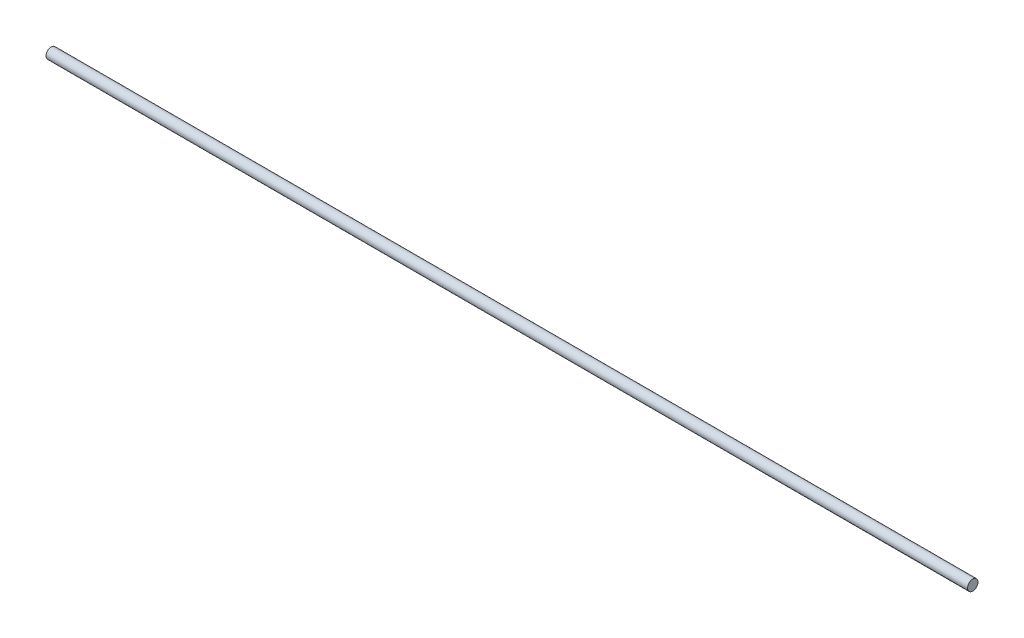
ISO-10303-21;
HEADER;
FILE_DESCRIPTION(('STEP AP214'),'2;1');
FILE_NAME('part.step','',(''),(''),'','','');
FILE_SCHEMA(('AUTOMOTIVE_DESIGN { 1 0 10303 214 1 1 1 1 }'));
ENDSEC;
DATA;
#1=APPLICATION_CONTEXT('core data for automotive mechanical design processes');
#2=APPLICATION_PROTOCOL_DEFINITION('international standard','automotive_design',2000,#1);
#3=PRODUCT_CONTEXT('',#1,'mechanical');
#4=PRODUCT('Part','Part','',(#3));
#5=PRODUCT_RELATED_PRODUCT_CATEGORY('part','',(#4));
#6=PRODUCT_DEFINITION_FORMATION('','',#4);
#7=PRODUCT_DEFINITION_CONTEXT('part definition',#1,'design');
#8=PRODUCT_DEFINITION('design','',#6,#7);
#9=PRODUCT_DEFINITION_SHAPE('','',#8);
#10=(LENGTH_UNIT() NAMED_UNIT(*) SI_UNIT(.MILLI.,.METRE.));
#11=(NAMED_UNIT(*) PLANE_ANGLE_UNIT() SI_UNIT($,.RADIAN.));
#12=(NAMED_UNIT(*) SI_UNIT($,.STERADIAN.) SOLID_ANGLE_UNIT());
#13=UNCERTAINTY_MEASURE_WITH_UNIT(LENGTH_MEASURE(1.E-05),#10,'distance_accuracy_value','');
#14=(GEOMETRIC_REPRESENTATION_CONTEXT(3) GLOBAL_UNCERTAINTY_ASSIGNED_CONTEXT((#13)) GLOBAL_UNIT_ASSIGNED_CONTEXT((#10,
#11,#12)) REPRESENTATION_CONTEXT('',''));
#15=CARTESIAN_POINT('',(0.,0.,0.));
#16=DIRECTION('',(0.,0.,1.));
#17=DIRECTION('',(1.,0.,0.));
#18=AXIS2_PLACEMENT_3D('',#15,#16,#17);
#19=CARTESIAN_POINT('',(705.,0.,0.));
#20=DIRECTION('',(-1.,0.,0.));
#21=DIRECTION('',(0.,0.,1.));
#22=AXIS2_PLACEMENT_3D('',#19,#20,#21);
#23=CYLINDRICAL_SURFACE('',#22,4.);
#24=CARTESIAN_POINT('',(705.,0.,0.));
#25=DIRECTION('',(1.,0.,0.));
#26=DIRECTION('',(0.,0.,-1.));
#27=AXIS2_PLACEMENT_3D('',#24,#25,#26);
#28=CIRCLE('',#27,4.);
#29=CARTESIAN_POINT('',(705.,0.,-4.));
#30=VERTEX_POINT('',#29);
#31=EDGE_CURVE('E10',#30,#30,#28,.T.);
#32=ORIENTED_EDGE('',*,*,#31,.F.);
#33=EDGE_LOOP('',(#32));
#34=FACE_BOUND('',#33,.T.);
#35=CARTESIAN_POINT('',(0.,0.,0.));
#36=DIRECTION('',(1.,0.,0.));
#37=DIRECTION('',(0.,0.,-1.));
#38=AXIS2_PLACEMENT_3D('',#35,#36,#37);
#39=CIRCLE('',#38,4.);
#40=CARTESIAN_POINT('',(0.,0.,-4.));
#41=VERTEX_POINT('',#40);
#42=EDGE_CURVE('E40',#41,#41,#39,.T.);
#43=ORIENTED_EDGE('',*,*,#42,.T.);
#44=EDGE_LOOP('',(#43));
#45=FACE_BOUND('',#44,.T.);
#46=ADVANCED_FACE('F37',(#34,#45),#23,.T.);
#47=CARTESIAN_POINT('',(705.,0.,0.));
#48=DIRECTION('',(1.,0.,0.));
#49=DIRECTION('',(0.,0.,-1.));
#50=AXIS2_PLACEMENT_3D('',#47,#48,#49);
#51=PLANE('',#50);
#52=ORIENTED_EDGE('',*,*,#31,.T.);
#53=EDGE_LOOP('',(#52));
#54=FACE_BOUND('',#53,.T.);
#55=ADVANCED_FACE('F52',(#54),#51,.T.);
#56=CARTESIAN_POINT('',(0.,0.,0.));
#57=DIRECTION('',(1.,0.,0.));
#58=DIRECTION('',(0.,0.,-1.));
#59=AXIS2_PLACEMENT_3D('',#56,#57,#58);
#60=PLANE('',#59);
#61=ORIENTED_EDGE('',*,*,#42,.F.);
#62=EDGE_LOOP('',(#61));
#63=FACE_BOUND('',#62,.T.);
#64=ADVANCED_FACE('F50',(#63),#60,.F.);
#65=CLOSED_SHELL('',(#46,#55,#64));
#66=MANIFOLD_SOLID_BREP('B2',#65);
#67=ADVANCED_BREP_SHAPE_REPRESENTATION('',(#18,#66),#14);
#68=SHAPE_DEFINITION_REPRESENTATION(#9,#67);
ENDSEC;
END-ISO-10303-21;
